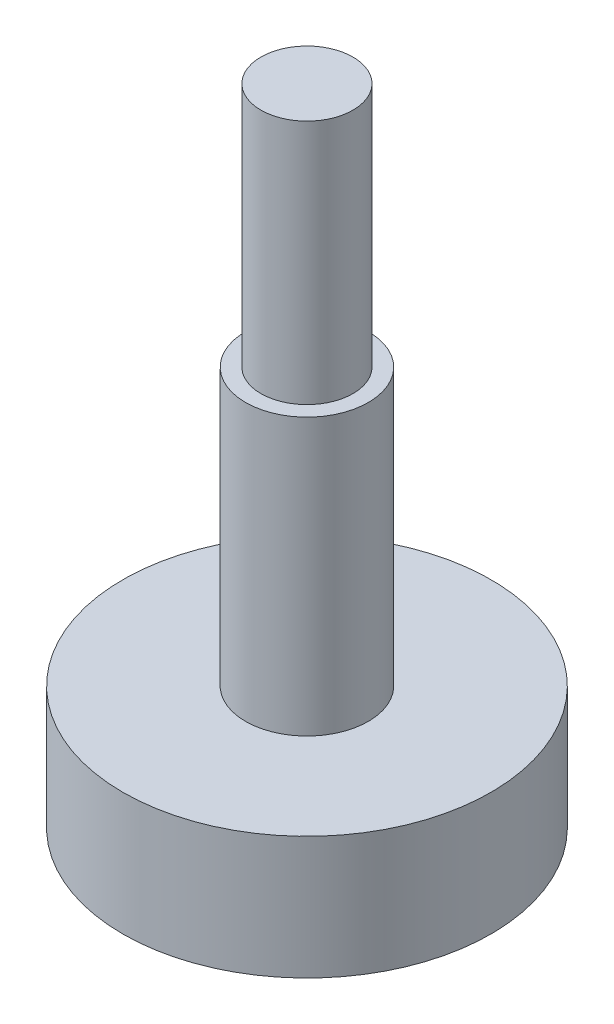
ISO-10303-21;
HEADER;
FILE_DESCRIPTION(('STEP AP214'),'2;1');
FILE_NAME('part.step','',(''),(''),'','','');
FILE_SCHEMA(('AUTOMOTIVE_DESIGN { 1 0 10303 214 1 1 1 1 }'));
ENDSEC;
DATA;
#1=APPLICATION_CONTEXT('core data for automotive mechanical design processes');
#2=APPLICATION_PROTOCOL_DEFINITION('international standard','automotive_design',2000,#1);
#3=PRODUCT_CONTEXT('',#1,'mechanical');
#4=PRODUCT('Part','Part','',(#3));
#5=PRODUCT_RELATED_PRODUCT_CATEGORY('part','',(#4));
#6=PRODUCT_DEFINITION_FORMATION('','',#4);
#7=PRODUCT_DEFINITION_CONTEXT('part definition',#1,'design');
#8=PRODUCT_DEFINITION('design','',#6,#7);
#9=PRODUCT_DEFINITION_SHAPE('','',#8);
#10=(LENGTH_UNIT() NAMED_UNIT(*) SI_UNIT(.MILLI.,.METRE.));
#11=(NAMED_UNIT(*) PLANE_ANGLE_UNIT() SI_UNIT($,.RADIAN.));
#12=(NAMED_UNIT(*) SI_UNIT($,.STERADIAN.) SOLID_ANGLE_UNIT());
#13=UNCERTAINTY_MEASURE_WITH_UNIT(LENGTH_MEASURE(1.E-05),#10,'distance_accuracy_value','');
#14=(GEOMETRIC_REPRESENTATION_CONTEXT(3) GLOBAL_UNCERTAINTY_ASSIGNED_CONTEXT((#13)) GLOBAL_UNIT_ASSIGNED_CONTEXT((#10,
#11,#12)) REPRESENTATION_CONTEXT('',''));
#15=CARTESIAN_POINT('',(0.,0.,0.));
#16=DIRECTION('',(0.,0.,1.));
#17=DIRECTION('',(1.,0.,0.));
#18=AXIS2_PLACEMENT_3D('',#15,#16,#17);
#19=CARTESIAN_POINT('',(0.,0.,0.));
#20=DIRECTION('',(0.,1.,0.));
#21=DIRECTION('',(0.,0.,1.));
#22=AXIS2_PLACEMENT_3D('',#19,#20,#21);
#23=PLANE('',#22);
#24=DIRECTION('',(0.866025403784438,0.,0.5));
#25=VECTOR('',#24,1.);
#26=CARTESIAN_POINT('',(0.,0.,-1.73205080756888));
#27=LINE('',#26,#25);
#28=CARTESIAN_POINT('',(0.,0.,-1.73205080756888));
#29=VERTEX_POINT('',#28);
#30=CARTESIAN_POINT('',(1.5,0.,-0.866025403784438));
#31=VERTEX_POINT('',#30);
#32=EDGE_CURVE('E121',#29,#31,#27,.T.);
#33=ORIENTED_EDGE('',*,*,#32,.F.);
#34=DIRECTION('',(0.866025403784439,0.,-0.5));
#35=VECTOR('',#34,1.);
#36=CARTESIAN_POINT('',(-1.5,0.,-0.866025403784439));
#37=LINE('',#36,#35);
#38=CARTESIAN_POINT('',(-1.5,0.,-0.866025403784439));
#39=VERTEX_POINT('',#38);
#40=EDGE_CURVE('E47',#39,#29,#37,.T.);
#41=ORIENTED_EDGE('',*,*,#40,.F.);
#42=DIRECTION('',(0.,0.,-1.));
#43=VECTOR('',#42,1.);
#44=CARTESIAN_POINT('',(-1.5,0.,0.86602540378444));
#45=LINE('',#44,#43);
#46=CARTESIAN_POINT('',(-1.5,0.,0.86602540378444));
#47=VERTEX_POINT('',#46);
#48=EDGE_CURVE('E130',#47,#39,#45,.T.);
#49=ORIENTED_EDGE('',*,*,#48,.F.);
#50=DIRECTION('',(-0.866025403784439,0.,-0.5));
#51=VECTOR('',#50,1.);
#52=CARTESIAN_POINT('',(0.,0.,1.73205080756888));
#53=LINE('',#52,#51);
#54=CARTESIAN_POINT('',(0.,0.,1.73205080756888));
#55=VERTEX_POINT('',#54);
#56=EDGE_CURVE('E128',#55,#47,#53,.T.);
#57=ORIENTED_EDGE('',*,*,#56,.F.);
#58=DIRECTION('',(-0.866025403784439,0.,0.5));
#59=VECTOR('',#58,1.);
#60=CARTESIAN_POINT('',(1.5,0.,0.86602540378444));
#61=LINE('',#60,#59);
#62=CARTESIAN_POINT('',(1.5,0.,0.86602540378444));
#63=VERTEX_POINT('',#62);
#64=EDGE_CURVE('E95',#63,#55,#61,.T.);
#65=ORIENTED_EDGE('',*,*,#64,.F.);
#66=DIRECTION('',(0.,0.,1.));
#67=VECTOR('',#66,1.);
#68=CARTESIAN_POINT('',(1.5,0.,-0.866025403784438));
#69=LINE('',#68,#67);
#70=EDGE_CURVE('E124',#31,#63,#69,.T.);
#71=ORIENTED_EDGE('',*,*,#70,.F.);
#72=EDGE_LOOP('',(#33,#41,#49,#57,#65,#71));
#73=FACE_BOUND('',#72,.T.);
#74=CARTESIAN_POINT('',(0.,0.,0.));
#75=DIRECTION('',(0.,1.,0.));
#76=DIRECTION('',(0.,0.,1.));
#77=AXIS2_PLACEMENT_3D('',#74,#75,#76);
#78=CIRCLE('',#77,6.);
#79=CARTESIAN_POINT('',(0.,0.,6.));
#80=VERTEX_POINT('',#79);
#81=EDGE_CURVE('E11',#80,#80,#78,.T.);
#82=ORIENTED_EDGE('',*,*,#81,.F.);
#83=EDGE_LOOP('',(#82));
#84=FACE_BOUND('',#83,.T.);
#85=ADVANCED_FACE('F33',(#73,#84),#23,.F.);
#86=CARTESIAN_POINT('',(0.,21.,0.));
#87=DIRECTION('',(0.,1.,0.));
#88=DIRECTION('',(0.,0.,1.));
#89=AXIS2_PLACEMENT_3D('',#86,#87,#88);
#90=CYLINDRICAL_SURFACE('',#89,6.);
#91=CARTESIAN_POINT('',(0.,4.,0.));
#92=DIRECTION('',(0.,1.,0.));
#93=DIRECTION('',(0.,0.,1.));
#94=AXIS2_PLACEMENT_3D('',#91,#92,#93);
#95=CIRCLE('',#94,6.);
#96=CARTESIAN_POINT('',(0.,4.,6.));
#97=VERTEX_POINT('',#96);
#98=EDGE_CURVE('E40',#97,#97,#95,.T.);
#99=ORIENTED_EDGE('',*,*,#98,.F.);
#100=EDGE_LOOP('',(#99));
#101=FACE_BOUND('',#100,.T.);
#102=ORIENTED_EDGE('',*,*,#81,.T.);
#103=EDGE_LOOP('',(#102));
#104=FACE_BOUND('',#103,.T.);
#105=ADVANCED_FACE('F155',(#101,#104),#90,.T.);
#106=CARTESIAN_POINT('',(6.,4.,0.));
#107=DIRECTION('',(0.,-1.,0.));
#108=DIRECTION('',(0.,0.,-1.));
#109=AXIS2_PLACEMENT_3D('',#106,#107,#108);
#110=PLANE('',#109);
#111=CARTESIAN_POINT('',(0.,4.,0.));
#112=DIRECTION('',(0.,1.,0.));
#113=DIRECTION('',(0.,0.,1.));
#114=AXIS2_PLACEMENT_3D('',#111,#112,#113);
#115=CIRCLE('',#114,2.);
#116=CARTESIAN_POINT('',(0.,4.,2.));
#117=VERTEX_POINT('',#116);
#118=EDGE_CURVE('E148',#117,#117,#115,.T.);
#119=ORIENTED_EDGE('',*,*,#118,.F.);
#120=EDGE_LOOP('',(#119));
#121=FACE_BOUND('',#120,.T.);
#122=ORIENTED_EDGE('',*,*,#98,.T.);
#123=EDGE_LOOP('',(#122));
#124=FACE_BOUND('',#123,.T.);
#125=ADVANCED_FACE('F153',(#121,#124),#110,.F.);
#126=CARTESIAN_POINT('',(0.,21.,0.));
#127=DIRECTION('',(0.,1.,0.));
#128=DIRECTION('',(0.,0.,1.));
#129=AXIS2_PLACEMENT_3D('',#126,#127,#128);
#130=CYLINDRICAL_SURFACE('',#129,2.00000000000001);
#131=CARTESIAN_POINT('',(0.,13.,0.));
#132=DIRECTION('',(0.,1.,0.));
#133=DIRECTION('',(0.,0.,1.));
#134=AXIS2_PLACEMENT_3D('',#131,#132,#133);
#135=CIRCLE('',#134,2.00000000000001);
#136=CARTESIAN_POINT('',(0.,13.,2.00000000000001));
#137=VERTEX_POINT('',#136);
#138=EDGE_CURVE('E145',#137,#137,#135,.T.);
#139=ORIENTED_EDGE('',*,*,#138,.F.);
#140=EDGE_LOOP('',(#139));
#141=FACE_BOUND('',#140,.T.);
#142=ORIENTED_EDGE('',*,*,#118,.T.);
#143=EDGE_LOOP('',(#142));
#144=FACE_BOUND('',#143,.T.);
#145=ADVANCED_FACE('F192',(#141,#144),#130,.T.);
#146=CARTESIAN_POINT('',(2.00000000000001,13.,0.));
#147=DIRECTION('',(0.,-1.,0.));
#148=DIRECTION('',(0.,0.,-1.));
#149=AXIS2_PLACEMENT_3D('',#146,#147,#148);
#150=PLANE('',#149);
#151=CARTESIAN_POINT('',(0.,13.,0.));
#152=DIRECTION('',(0.,1.,0.));
#153=DIRECTION('',(0.,0.,1.));
#154=AXIS2_PLACEMENT_3D('',#151,#152,#153);
#155=CIRCLE('',#154,1.5);
#156=CARTESIAN_POINT('',(0.,13.,1.5));
#157=VERTEX_POINT('',#156);
#158=EDGE_CURVE('E142',#157,#157,#155,.T.);
#159=ORIENTED_EDGE('',*,*,#158,.F.);
#160=EDGE_LOOP('',(#159));
#161=FACE_BOUND('',#160,.T.);
#162=ORIENTED_EDGE('',*,*,#138,.T.);
#163=EDGE_LOOP('',(#162));
#164=FACE_BOUND('',#163,.T.);
#165=ADVANCED_FACE('F188',(#161,#164),#150,.F.);
#166=CARTESIAN_POINT('',(0.,21.,0.));
#167=DIRECTION('',(0.,1.,0.));
#168=DIRECTION('',(0.,0.,1.));
#169=AXIS2_PLACEMENT_3D('',#166,#167,#168);
#170=CYLINDRICAL_SURFACE('',#169,1.5);
#171=CARTESIAN_POINT('',(0.,21.,0.));
#172=DIRECTION('',(0.,1.,0.));
#173=DIRECTION('',(0.,0.,1.));
#174=AXIS2_PLACEMENT_3D('',#171,#172,#173);
#175=CIRCLE('',#174,1.5);
#176=CARTESIAN_POINT('',(0.,21.,1.5));
#177=VERTEX_POINT('',#176);
#178=EDGE_CURVE('E134',#177,#177,#175,.T.);
#179=ORIENTED_EDGE('',*,*,#178,.F.);
#180=EDGE_LOOP('',(#179));
#181=FACE_BOUND('',#180,.T.);
#182=ORIENTED_EDGE('',*,*,#158,.T.);
#183=EDGE_LOOP('',(#182));
#184=FACE_BOUND('',#183,.T.);
#185=ADVANCED_FACE('F180',(#181,#184),#170,.T.);
#186=CARTESIAN_POINT('',(1.5,21.,0.));
#187=DIRECTION('',(0.,-1.,0.));
#188=DIRECTION('',(0.,0.,-1.));
#189=AXIS2_PLACEMENT_3D('',#186,#187,#188);
#190=PLANE('',#189);
#191=ORIENTED_EDGE('',*,*,#178,.T.);
#192=EDGE_LOOP('',(#191));
#193=FACE_BOUND('',#192,.T.);
#194=ADVANCED_FACE('F173',(#193),#190,.F.);
#195=CARTESIAN_POINT('',(-1.5,2.,-0.866025403784439));
#196=DIRECTION('',(-0.5,0.,-0.866025403784439));
#197=DIRECTION('',(-0.866025403784439,0.,0.5));
#198=AXIS2_PLACEMENT_3D('',#195,#196,#197);
#199=PLANE('',#198);
#200=ORIENTED_EDGE('',*,*,#40,.T.);
#201=DIRECTION('',(0.,-1.,0.));
#202=VECTOR('',#201,1.);
#203=CARTESIAN_POINT('',(0.,2.,-1.73205080756888));
#204=LINE('',#203,#202);
#205=CARTESIAN_POINT('',(0.,2.,-1.73205080756888));
#206=VERTEX_POINT('',#205);
#207=EDGE_CURVE('E77',#206,#29,#204,.T.);
#208=ORIENTED_EDGE('',*,*,#207,.F.);
#209=DIRECTION('',(0.866025403784439,0.,-0.5));
#210=VECTOR('',#209,1.);
#211=CARTESIAN_POINT('',(-1.5,2.,-0.866025403784439));
#212=LINE('',#211,#210);
#213=CARTESIAN_POINT('',(-1.5,2.,-0.866025403784439));
#214=VERTEX_POINT('',#213);
#215=EDGE_CURVE('E132',#214,#206,#212,.T.);
#216=ORIENTED_EDGE('',*,*,#215,.F.);
#217=DIRECTION('',(0.,-1.,0.));
#218=VECTOR('',#217,1.);
#219=CARTESIAN_POINT('',(-1.5,2.,-0.866025403784439));
#220=LINE('',#219,#218);
#221=EDGE_CURVE('E55',#214,#39,#220,.T.);
#222=ORIENTED_EDGE('',*,*,#221,.T.);
#223=EDGE_LOOP('',(#200,#208,#216,#222));
#224=FACE_BOUND('',#223,.T.);
#225=ADVANCED_FACE('F170',(#224),#199,.F.);
#226=CARTESIAN_POINT('',(-1.5,2.,0.86602540378444));
#227=DIRECTION('',(-1.,0.,0.));
#228=DIRECTION('',(0.,0.,1.));
#229=AXIS2_PLACEMENT_3D('',#226,#227,#228);
#230=PLANE('',#229);
#231=ORIENTED_EDGE('',*,*,#48,.T.);
#232=ORIENTED_EDGE('',*,*,#221,.F.);
#233=DIRECTION('',(0.,0.,-1.));
#234=VECTOR('',#233,1.);
#235=CARTESIAN_POINT('',(-1.5,2.,0.86602540378444));
#236=LINE('',#235,#234);
#237=CARTESIAN_POINT('',(-1.5,2.,0.86602540378444));
#238=VERTEX_POINT('',#237);
#239=EDGE_CURVE('E107',#238,#214,#236,.T.);
#240=ORIENTED_EDGE('',*,*,#239,.F.);
#241=DIRECTION('',(0.,-1.,0.));
#242=VECTOR('',#241,1.);
#243=CARTESIAN_POINT('',(-1.5,2.,0.86602540378444));
#244=LINE('',#243,#242);
#245=EDGE_CURVE('E99',#238,#47,#244,.T.);
#246=ORIENTED_EDGE('',*,*,#245,.T.);
#247=EDGE_LOOP('',(#231,#232,#240,#246));
#248=FACE_BOUND('',#247,.T.);
#249=ADVANCED_FACE('F172',(#248),#230,.F.);
#250=CARTESIAN_POINT('',(0.,2.,1.73205080756888));
#251=DIRECTION('',(-0.5,0.,0.866025403784439));
#252=DIRECTION('',(0.866025403784439,0.,0.5));
#253=AXIS2_PLACEMENT_3D('',#250,#251,#252);
#254=PLANE('',#253);
#255=ORIENTED_EDGE('',*,*,#56,.T.);
#256=ORIENTED_EDGE('',*,*,#245,.F.);
#257=DIRECTION('',(-0.866025403784439,0.,-0.5));
#258=VECTOR('',#257,1.);
#259=CARTESIAN_POINT('',(0.,2.,1.73205080756888));
#260=LINE('',#259,#258);
#261=CARTESIAN_POINT('',(0.,2.,1.73205080756888));
#262=VERTEX_POINT('',#261);
#263=EDGE_CURVE('E103',#262,#238,#260,.T.);
#264=ORIENTED_EDGE('',*,*,#263,.F.);
#265=DIRECTION('',(0.,-1.,0.));
#266=VECTOR('',#265,1.);
#267=CARTESIAN_POINT('',(0.,2.,1.73205080756888));
#268=LINE('',#267,#266);
#269=EDGE_CURVE('E88',#262,#55,#268,.T.);
#270=ORIENTED_EDGE('',*,*,#269,.T.);
#271=EDGE_LOOP('',(#255,#256,#264,#270));
#272=FACE_BOUND('',#271,.T.);
#273=ADVANCED_FACE('F104',(#272),#254,.F.);
#274=CARTESIAN_POINT('',(1.5,2.,0.86602540378444));
#275=DIRECTION('',(0.5,0.,0.866025403784439));
#276=DIRECTION('',(0.866025403784439,0.,-0.5));
#277=AXIS2_PLACEMENT_3D('',#274,#275,#276);
#278=PLANE('',#277);
#279=ORIENTED_EDGE('',*,*,#64,.T.);
#280=ORIENTED_EDGE('',*,*,#269,.F.);
#281=DIRECTION('',(-0.866025403784439,0.,0.5));
#282=VECTOR('',#281,1.);
#283=CARTESIAN_POINT('',(1.5,2.,0.86602540378444));
#284=LINE('',#283,#282);
#285=CARTESIAN_POINT('',(1.5,2.,0.86602540378444));
#286=VERTEX_POINT('',#285);
#287=EDGE_CURVE('E92',#286,#262,#284,.T.);
#288=ORIENTED_EDGE('',*,*,#287,.F.);
#289=DIRECTION('',(0.,-1.,0.));
#290=VECTOR('',#289,1.);
#291=CARTESIAN_POINT('',(1.5,2.,0.86602540378444));
#292=LINE('',#291,#290);
#293=EDGE_CURVE('E100',#286,#63,#292,.T.);
#294=ORIENTED_EDGE('',*,*,#293,.T.);
#295=EDGE_LOOP('',(#279,#280,#288,#294));
#296=FACE_BOUND('',#295,.T.);
#297=ADVANCED_FACE('F90',(#296),#278,.F.);
#298=CARTESIAN_POINT('',(1.5,2.,-0.866025403784438));
#299=DIRECTION('',(1.,0.,0.));
#300=DIRECTION('',(0.,0.,-1.));
#301=AXIS2_PLACEMENT_3D('',#298,#299,#300);
#302=PLANE('',#301);
#303=ORIENTED_EDGE('',*,*,#70,.T.);
#304=ORIENTED_EDGE('',*,*,#293,.F.);
#305=DIRECTION('',(0.,0.,1.));
#306=VECTOR('',#305,1.);
#307=CARTESIAN_POINT('',(1.5,2.,-0.866025403784438));
#308=LINE('',#307,#306);
#309=CARTESIAN_POINT('',(1.5,2.,-0.866025403784438));
#310=VERTEX_POINT('',#309);
#311=EDGE_CURVE('E113',#310,#286,#308,.T.);
#312=ORIENTED_EDGE('',*,*,#311,.F.);
#313=DIRECTION('',(0.,-1.,0.));
#314=VECTOR('',#313,1.);
#315=CARTESIAN_POINT('',(1.5,2.,-0.866025403784438));
#316=LINE('',#315,#314);
#317=EDGE_CURVE('E137',#310,#31,#316,.T.);
#318=ORIENTED_EDGE('',*,*,#317,.T.);
#319=EDGE_LOOP('',(#303,#304,#312,#318));
#320=FACE_BOUND('',#319,.T.);
#321=ADVANCED_FACE('F253',(#320),#302,.F.);
#322=CARTESIAN_POINT('',(0.,2.,-1.73205080756888));
#323=DIRECTION('',(0.5,0.,-0.866025403784438));
#324=DIRECTION('',(-0.866025403784438,0.,-0.5));
#325=AXIS2_PLACEMENT_3D('',#322,#323,#324);
#326=PLANE('',#325);
#327=ORIENTED_EDGE('',*,*,#32,.T.);
#328=ORIENTED_EDGE('',*,*,#317,.F.);
#329=DIRECTION('',(0.866025403784438,0.,0.5));
#330=VECTOR('',#329,1.);
#331=CARTESIAN_POINT('',(0.,2.,-1.73205080756888));
#332=LINE('',#331,#330);
#333=EDGE_CURVE('E115',#206,#310,#332,.T.);
#334=ORIENTED_EDGE('',*,*,#333,.F.);
#335=ORIENTED_EDGE('',*,*,#207,.T.);
#336=EDGE_LOOP('',(#327,#328,#334,#335));
#337=FACE_BOUND('',#336,.T.);
#338=ADVANCED_FACE('F168',(#337),#326,.F.);
#339=CARTESIAN_POINT('',(0.,2.,0.));
#340=DIRECTION('',(0.,-1.,0.));
#341=DIRECTION('',(0.,0.,-1.));
#342=AXIS2_PLACEMENT_3D('',#339,#340,#341);
#343=PLANE('',#342);
#344=ORIENTED_EDGE('',*,*,#215,.T.);
#345=ORIENTED_EDGE('',*,*,#333,.T.);
#346=ORIENTED_EDGE('',*,*,#311,.T.);
#347=ORIENTED_EDGE('',*,*,#287,.T.);
#348=ORIENTED_EDGE('',*,*,#263,.T.);
#349=ORIENTED_EDGE('',*,*,#239,.T.);
#350=EDGE_LOOP('',(#344,#345,#346,#347,#348,#349));
#351=FACE_BOUND('',#350,.T.);
#352=ADVANCED_FACE('F110',(#351),#343,.T.);
#353=CLOSED_SHELL('',(#85,#105,#125,#145,#165,#185,#194,#225,#249,#273,#297,#321,#338,#352));
#354=MANIFOLD_SOLID_BREP('B2',#353);
#355=ADVANCED_BREP_SHAPE_REPRESENTATION('',(#18,#354),#14);
#356=SHAPE_DEFINITION_REPRESENTATION(#9,#355);
ENDSEC;
END-ISO-10303-21;
